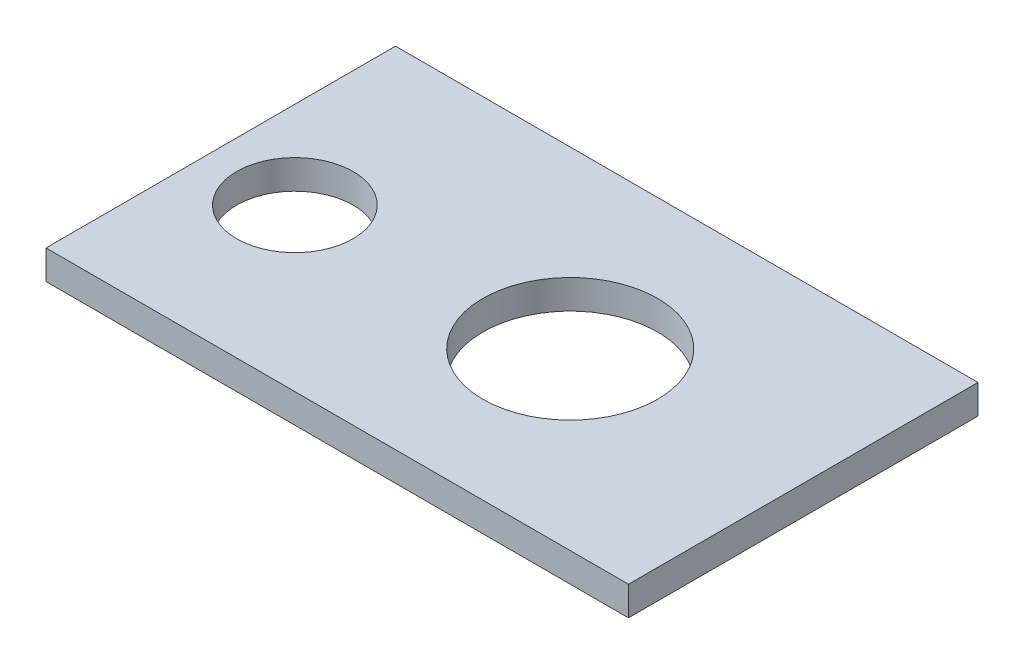
ISO-10303-21;
HEADER;
FILE_DESCRIPTION(('STEP AP214'),'2;1');
FILE_NAME('part.step','',(''),(''),'','','');
FILE_SCHEMA(('AUTOMOTIVE_DESIGN { 1 0 10303 214 1 1 1 1 }'));
ENDSEC;
DATA;
#1=APPLICATION_CONTEXT('core data for automotive mechanical design processes');
#2=APPLICATION_PROTOCOL_DEFINITION('international standard','automotive_design',2000,#1);
#3=PRODUCT_CONTEXT('',#1,'mechanical');
#4=PRODUCT('Part','Part','',(#3));
#5=PRODUCT_RELATED_PRODUCT_CATEGORY('part','',(#4));
#6=PRODUCT_DEFINITION_FORMATION('','',#4);
#7=PRODUCT_DEFINITION_CONTEXT('part definition',#1,'design');
#8=PRODUCT_DEFINITION('design','',#6,#7);
#9=PRODUCT_DEFINITION_SHAPE('','',#8);
#10=(LENGTH_UNIT() NAMED_UNIT(*) SI_UNIT(.MILLI.,.METRE.));
#11=(NAMED_UNIT(*) PLANE_ANGLE_UNIT() SI_UNIT($,.RADIAN.));
#12=(NAMED_UNIT(*) SI_UNIT($,.STERADIAN.) SOLID_ANGLE_UNIT());
#13=UNCERTAINTY_MEASURE_WITH_UNIT(LENGTH_MEASURE(1.E-05),#10,'distance_accuracy_value','');
#14=(GEOMETRIC_REPRESENTATION_CONTEXT(3) GLOBAL_UNCERTAINTY_ASSIGNED_CONTEXT((#13)) GLOBAL_UNIT_ASSIGNED_CONTEXT((#10,
#11,#12)) REPRESENTATION_CONTEXT('',''));
#15=CARTESIAN_POINT('',(0.,0.,0.));
#16=DIRECTION('',(0.,0.,1.));
#17=DIRECTION('',(1.,0.,0.));
#18=AXIS2_PLACEMENT_3D('',#15,#16,#17);
#19=CARTESIAN_POINT('',(1000.,50.,0.));
#20=DIRECTION('',(-1.,0.,0.));
#21=DIRECTION('',(0.,0.,1.));
#22=AXIS2_PLACEMENT_3D('',#19,#20,#21);
#23=PLANE('',#22);
#24=DIRECTION('',(0.,0.,-1.));
#25=VECTOR('',#24,1.);
#26=CARTESIAN_POINT('',(1000.,0.,0.));
#27=LINE('',#26,#25);
#28=CARTESIAN_POINT('',(1000.,0.,0.));
#29=VERTEX_POINT('',#28);
#30=CARTESIAN_POINT('',(1000.,0.,-600.));
#31=VERTEX_POINT('',#30);
#32=EDGE_CURVE('E115',#29,#31,#27,.T.);
#33=ORIENTED_EDGE('',*,*,#32,.T.);
#34=DIRECTION('',(0.,-1.,0.));
#35=VECTOR('',#34,1.);
#36=CARTESIAN_POINT('',(1000.,50.,-600.));
#37=LINE('',#36,#35);
#38=CARTESIAN_POINT('',(1000.,50.,-600.));
#39=VERTEX_POINT('',#38);
#40=EDGE_CURVE('E11',#39,#31,#37,.T.);
#41=ORIENTED_EDGE('',*,*,#40,.F.);
#42=DIRECTION('',(0.,0.,-1.));
#43=VECTOR('',#42,1.);
#44=CARTESIAN_POINT('',(1000.,50.,0.));
#45=LINE('',#44,#43);
#46=CARTESIAN_POINT('',(1000.,50.,0.));
#47=VERTEX_POINT('',#46);
#48=EDGE_CURVE('E99',#47,#39,#45,.T.);
#49=ORIENTED_EDGE('',*,*,#48,.F.);
#50=DIRECTION('',(0.,-1.,0.));
#51=VECTOR('',#50,1.);
#52=CARTESIAN_POINT('',(1000.,50.,0.));
#53=LINE('',#52,#51);
#54=EDGE_CURVE('E111',#47,#29,#53,.T.);
#55=ORIENTED_EDGE('',*,*,#54,.T.);
#56=EDGE_LOOP('',(#33,#41,#49,#55));
#57=FACE_BOUND('',#56,.T.);
#58=ADVANCED_FACE('F47',(#57),#23,.F.);
#59=CARTESIAN_POINT('',(1000.,50.,-600.));
#60=DIRECTION('',(0.,0.,1.));
#61=DIRECTION('',(1.,0.,0.));
#62=AXIS2_PLACEMENT_3D('',#59,#60,#61);
#63=PLANE('',#62);
#64=DIRECTION('',(-1.,0.,0.));
#65=VECTOR('',#64,1.);
#66=CARTESIAN_POINT('',(1000.,0.,-600.));
#67=LINE('',#66,#65);
#68=CARTESIAN_POINT('',(0.,0.,-600.));
#69=VERTEX_POINT('',#68);
#70=EDGE_CURVE('E104',#31,#69,#67,.T.);
#71=ORIENTED_EDGE('',*,*,#70,.T.);
#72=DIRECTION('',(0.,-1.,0.));
#73=VECTOR('',#72,1.);
#74=CARTESIAN_POINT('',(0.,50.,-600.));
#75=LINE('',#74,#73);
#76=CARTESIAN_POINT('',(0.,50.,-600.));
#77=VERTEX_POINT('',#76);
#78=EDGE_CURVE('E56',#77,#69,#75,.T.);
#79=ORIENTED_EDGE('',*,*,#78,.F.);
#80=DIRECTION('',(-1.,0.,0.));
#81=VECTOR('',#80,1.);
#82=CARTESIAN_POINT('',(1000.,50.,-600.));
#83=LINE('',#82,#81);
#84=EDGE_CURVE('E94',#39,#77,#83,.T.);
#85=ORIENTED_EDGE('',*,*,#84,.F.);
#86=ORIENTED_EDGE('',*,*,#40,.T.);
#87=EDGE_LOOP('',(#71,#79,#85,#86));
#88=FACE_BOUND('',#87,.T.);
#89=ADVANCED_FACE('F103',(#88),#63,.F.);
#90=CARTESIAN_POINT('',(0.,50.,-600.));
#91=DIRECTION('',(1.,0.,0.));
#92=DIRECTION('',(0.,0.,-1.));
#93=AXIS2_PLACEMENT_3D('',#90,#91,#92);
#94=PLANE('',#93);
#95=DIRECTION('',(0.,0.,1.));
#96=VECTOR('',#95,1.);
#97=CARTESIAN_POINT('',(0.,0.,-600.));
#98=LINE('',#97,#96);
#99=CARTESIAN_POINT('',(0.,0.,0.));
#100=VERTEX_POINT('',#99);
#101=EDGE_CURVE('E81',#69,#100,#98,.T.);
#102=ORIENTED_EDGE('',*,*,#101,.T.);
#103=DIRECTION('',(0.,-1.,0.));
#104=VECTOR('',#103,1.);
#105=CARTESIAN_POINT('',(0.,50.,0.));
#106=LINE('',#105,#104);
#107=CARTESIAN_POINT('',(0.,50.,0.));
#108=VERTEX_POINT('',#107);
#109=EDGE_CURVE('E106',#108,#100,#106,.T.);
#110=ORIENTED_EDGE('',*,*,#109,.F.);
#111=DIRECTION('',(0.,0.,1.));
#112=VECTOR('',#111,1.);
#113=CARTESIAN_POINT('',(0.,50.,-600.));
#114=LINE('',#113,#112);
#115=EDGE_CURVE('E97',#77,#108,#114,.T.);
#116=ORIENTED_EDGE('',*,*,#115,.F.);
#117=ORIENTED_EDGE('',*,*,#78,.T.);
#118=EDGE_LOOP('',(#102,#110,#116,#117));
#119=FACE_BOUND('',#118,.T.);
#120=ADVANCED_FACE('F107',(#119),#94,.F.);
#121=CARTESIAN_POINT('',(0.,50.,0.));
#122=DIRECTION('',(0.,0.,-1.));
#123=DIRECTION('',(-1.,0.,0.));
#124=AXIS2_PLACEMENT_3D('',#121,#122,#123);
#125=PLANE('',#124);
#126=DIRECTION('',(1.,0.,0.));
#127=VECTOR('',#126,1.);
#128=CARTESIAN_POINT('',(0.,0.,0.));
#129=LINE('',#128,#127);
#130=EDGE_CURVE('E87',#100,#29,#129,.T.);
#131=ORIENTED_EDGE('',*,*,#130,.T.);
#132=ORIENTED_EDGE('',*,*,#54,.F.);
#133=DIRECTION('',(1.,0.,0.));
#134=VECTOR('',#133,1.);
#135=CARTESIAN_POINT('',(0.,50.,0.));
#136=LINE('',#135,#134);
#137=EDGE_CURVE('E64',#108,#47,#136,.T.);
#138=ORIENTED_EDGE('',*,*,#137,.F.);
#139=ORIENTED_EDGE('',*,*,#109,.T.);
#140=EDGE_LOOP('',(#131,#132,#138,#139));
#141=FACE_BOUND('',#140,.T.);
#142=ADVANCED_FACE('F129',(#141),#125,.F.);
#143=CARTESIAN_POINT('',(0.,50.,0.));
#144=DIRECTION('',(0.,1.,0.));
#145=DIRECTION('',(0.,0.,1.));
#146=AXIS2_PLACEMENT_3D('',#143,#144,#145);
#147=PLANE('',#146);
#148=CARTESIAN_POINT('',(150.,50.,-277.258789033599));
#149=DIRECTION('',(0.,1.,0.));
#150=DIRECTION('',(0.,0.,1.));
#151=AXIS2_PLACEMENT_3D('',#148,#149,#150);
#152=CIRCLE('',#151,99.9999999999999);
#153=CARTESIAN_POINT('',(150.,50.,-177.258789033599));
#154=VERTEX_POINT('',#153);
#155=EDGE_CURVE('E144',#154,#154,#152,.T.);
#156=ORIENTED_EDGE('',*,*,#155,.F.);
#157=EDGE_LOOP('',(#156));
#158=FACE_BOUND('',#157,.T.);
#159=CARTESIAN_POINT('',(600.,50.,-300.));
#160=DIRECTION('',(0.,1.,0.));
#161=DIRECTION('',(0.,0.,1.));
#162=AXIS2_PLACEMENT_3D('',#159,#160,#161);
#163=CIRCLE('',#162,150.);
#164=CARTESIAN_POINT('',(600.,50.,-150.));
#165=VERTEX_POINT('',#164);
#166=EDGE_CURVE('E140',#165,#165,#163,.T.);
#167=ORIENTED_EDGE('',*,*,#166,.F.);
#168=EDGE_LOOP('',(#167));
#169=FACE_BOUND('',#168,.T.);
#170=ORIENTED_EDGE('',*,*,#48,.T.);
#171=ORIENTED_EDGE('',*,*,#84,.T.);
#172=ORIENTED_EDGE('',*,*,#115,.T.);
#173=ORIENTED_EDGE('',*,*,#137,.T.);
#174=EDGE_LOOP('',(#170,#171,#172,#173));
#175=FACE_BOUND('',#174,.T.);
#176=ADVANCED_FACE('F95',(#158,#169,#175),#147,.T.);
#177=CARTESIAN_POINT('',(0.,0.,0.));
#178=DIRECTION('',(0.,1.,0.));
#179=DIRECTION('',(0.,0.,1.));
#180=AXIS2_PLACEMENT_3D('',#177,#178,#179);
#181=PLANE('',#180);
#182=CARTESIAN_POINT('',(150.,0.,-277.258789033599));
#183=DIRECTION('',(0.,1.,0.));
#184=DIRECTION('',(0.,0.,1.));
#185=AXIS2_PLACEMENT_3D('',#182,#183,#184);
#186=CIRCLE('',#185,99.9999999999999);
#187=CARTESIAN_POINT('',(150.,0.,-177.258789033599));
#188=VERTEX_POINT('',#187);
#189=EDGE_CURVE('E119',#188,#188,#186,.T.);
#190=ORIENTED_EDGE('',*,*,#189,.T.);
#191=EDGE_LOOP('',(#190));
#192=FACE_BOUND('',#191,.T.);
#193=CARTESIAN_POINT('',(600.,0.,-300.));
#194=DIRECTION('',(0.,1.,0.));
#195=DIRECTION('',(0.,0.,1.));
#196=AXIS2_PLACEMENT_3D('',#193,#194,#195);
#197=CIRCLE('',#196,150.);
#198=CARTESIAN_POINT('',(600.,0.,-150.));
#199=VERTEX_POINT('',#198);
#200=EDGE_CURVE('E136',#199,#199,#197,.T.);
#201=ORIENTED_EDGE('',*,*,#200,.T.);
#202=EDGE_LOOP('',(#201));
#203=FACE_BOUND('',#202,.T.);
#204=ORIENTED_EDGE('',*,*,#32,.F.);
#205=ORIENTED_EDGE('',*,*,#130,.F.);
#206=ORIENTED_EDGE('',*,*,#101,.F.);
#207=ORIENTED_EDGE('',*,*,#70,.F.);
#208=EDGE_LOOP('',(#204,#205,#206,#207));
#209=FACE_BOUND('',#208,.T.);
#210=ADVANCED_FACE('F132',(#192,#203,#209),#181,.F.);
#211=CARTESIAN_POINT('',(600.,0.,-300.));
#212=DIRECTION('',(0.,1.,0.));
#213=DIRECTION('',(0.,0.,1.));
#214=AXIS2_PLACEMENT_3D('',#211,#212,#213);
#215=CYLINDRICAL_SURFACE('',#214,150.);
#216=ORIENTED_EDGE('',*,*,#200,.F.);
#217=EDGE_LOOP('',(#216));
#218=FACE_BOUND('',#217,.T.);
#219=ORIENTED_EDGE('',*,*,#166,.T.);
#220=EDGE_LOOP('',(#219));
#221=FACE_BOUND('',#220,.T.);
#222=ADVANCED_FACE('F157',(#218,#221),#215,.F.);
#223=CARTESIAN_POINT('',(150.,0.,-277.258789033599));
#224=DIRECTION('',(0.,1.,0.));
#225=DIRECTION('',(0.,0.,1.));
#226=AXIS2_PLACEMENT_3D('',#223,#224,#225);
#227=CYLINDRICAL_SURFACE('',#226,99.9999999999999);
#228=ORIENTED_EDGE('',*,*,#189,.F.);
#229=EDGE_LOOP('',(#228));
#230=FACE_BOUND('',#229,.T.);
#231=ORIENTED_EDGE('',*,*,#155,.T.);
#232=EDGE_LOOP('',(#231));
#233=FACE_BOUND('',#232,.T.);
#234=ADVANCED_FACE('F154',(#230,#233),#227,.F.);
#235=CLOSED_SHELL('',(#58,#89,#120,#142,#176,#210,#222,#234));
#236=MANIFOLD_SOLID_BREP('B2',#235);
#237=ADVANCED_BREP_SHAPE_REPRESENTATION('',(#18,#236),#14);
#238=SHAPE_DEFINITION_REPRESENTATION(#9,#237);
ENDSEC;
END-ISO-10303-21;
